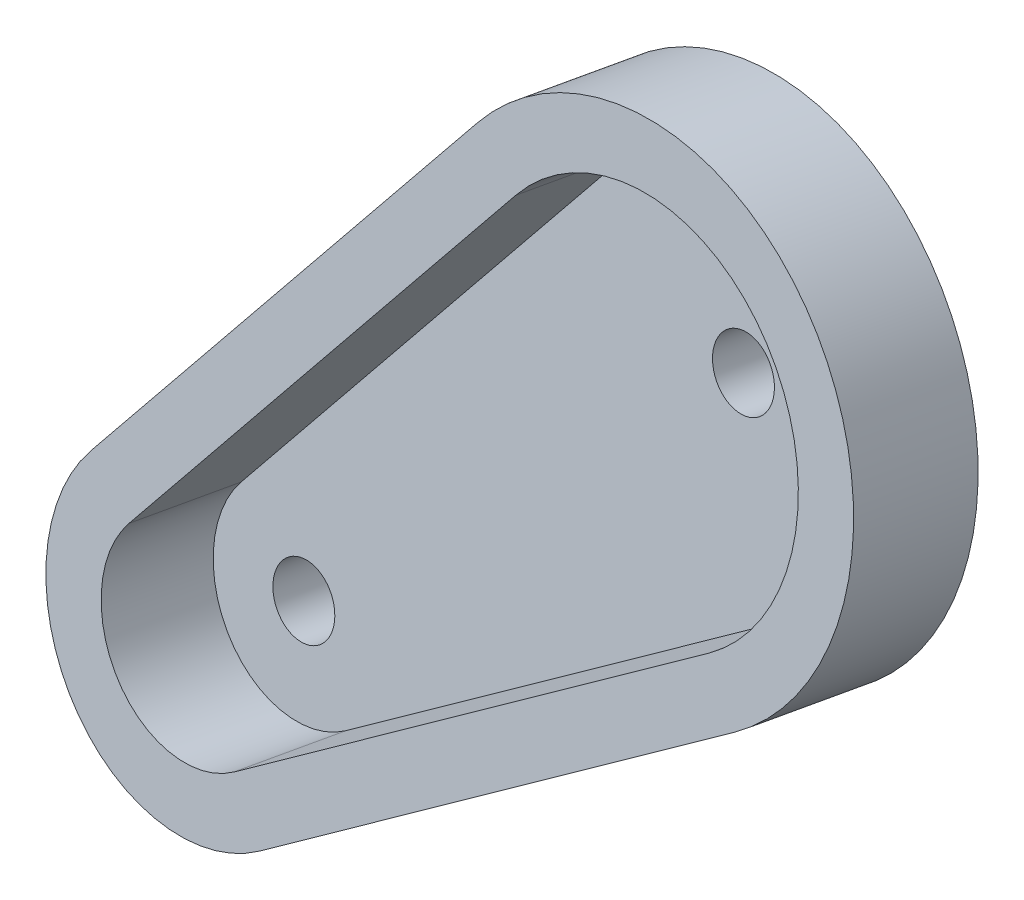
ISO-10303-21;
HEADER;
FILE_DESCRIPTION(('STEP AP214'),'2;1');
FILE_NAME('part.step','',(''),(''),'','','');
FILE_SCHEMA(('AUTOMOTIVE_DESIGN { 1 0 10303 214 1 1 1 1 }'));
ENDSEC;
DATA;
#1=APPLICATION_CONTEXT('core data for automotive mechanical design processes');
#2=APPLICATION_PROTOCOL_DEFINITION('international standard','automotive_design',2000,#1);
#3=PRODUCT_CONTEXT('',#1,'mechanical');
#4=PRODUCT('Part','Part','',(#3));
#5=PRODUCT_RELATED_PRODUCT_CATEGORY('part','',(#4));
#6=PRODUCT_DEFINITION_FORMATION('','',#4);
#7=PRODUCT_DEFINITION_CONTEXT('part definition',#1,'design');
#8=PRODUCT_DEFINITION('design','',#6,#7);
#9=PRODUCT_DEFINITION_SHAPE('','',#8);
#10=(LENGTH_UNIT() NAMED_UNIT(*) SI_UNIT(.MILLI.,.METRE.));
#11=(NAMED_UNIT(*) PLANE_ANGLE_UNIT() SI_UNIT($,.RADIAN.));
#12=(NAMED_UNIT(*) SI_UNIT($,.STERADIAN.) SOLID_ANGLE_UNIT());
#13=UNCERTAINTY_MEASURE_WITH_UNIT(LENGTH_MEASURE(1.E-05),#10,'distance_accuracy_value','');
#14=(GEOMETRIC_REPRESENTATION_CONTEXT(3) GLOBAL_UNCERTAINTY_ASSIGNED_CONTEXT((#13)) GLOBAL_UNIT_ASSIGNED_CONTEXT((#10,
#11,#12)) REPRESENTATION_CONTEXT('',''));
#15=CARTESIAN_POINT('',(0.,0.,0.));
#16=DIRECTION('',(0.,0.,1.));
#17=DIRECTION('',(1.,0.,0.));
#18=AXIS2_PLACEMENT_3D('',#15,#16,#17);
#19=CARTESIAN_POINT('',(139.042388148366,-142.913532001662,5.92533887196867));
#20=DIRECTION('',(0.0674581133210909,-0.12352330189874,-0.990046158941689));
#21=DIRECTION('',(0.,-0.992306526958391,0.123805317154703));
#22=AXIS2_PLACEMENT_3D('',#19,#20,#21);
#23=PLANE('',#22);
#24=CARTESIAN_POINT('',(156.822676569582,-126.081367524923,5.03675421849172));
#25=DIRECTION('',(-0.0674581133210909,0.12352330189874,0.990046158941689));
#26=DIRECTION('',(0.,-0.992306526958391,0.123805317154703));
#27=AXIS2_PLACEMENT_3D('',#24,#25,#26);
#28=CIRCLE('',#27,6.58589838486229);
#29=CARTESIAN_POINT('',(160.613864154695,-131.38739760596,5.95707970947262));
#30=VERTEX_POINT('',#29);
#31=CARTESIAN_POINT('',(151.685409363827,-122.049638120943,4.18370017243479));
#32=VERTEX_POINT('',#31);
#33=EDGE_CURVE('E187',#30,#32,#28,.T.);
#34=ORIENTED_EDGE('',*,*,#33,.F.);
#35=DIRECTION('',(0.814907250431126,0.579349073545028,-0.0167578094421691));
#36=VECTOR('',#35,1.);
#37=CARTESIAN_POINT('',(140.847575281559,-145.440016649436,6.36355505024256));
#38=LINE('',#37,#36);
#39=CARTESIAN_POINT('',(140.847575281559,-145.440016649436,6.36355505024256));
#40=VERTEX_POINT('',#39);
#41=EDGE_CURVE('E185',#40,#30,#38,.T.);
#42=ORIENTED_EDGE('',*,*,#41,.F.);
#43=CARTESIAN_POINT('',(139.042388148366,-142.913532001662,5.92533887196867));
#44=DIRECTION('',(-0.0674581133210909,0.12352330189874,0.990046158941689));
#45=DIRECTION('',(0.,-0.992306526958391,0.123805317154703));
#46=AXIS2_PLACEMENT_3D('',#43,#44,#45);
#47=CIRCLE('',#46,3.13589838486216);
#48=CARTESIAN_POINT('',(136.596260529671,-140.993810046157,5.51915422578908));
#49=VERTEX_POINT('',#48);
#50=EDGE_CURVE('E190',#49,#40,#47,.T.);
#51=ORIENTED_EDGE('',*,*,#50,.F.);
#52=DIRECTION('',(-0.622082216176631,-0.781013732742278,0.0550569303970384));
#53=VECTOR('',#52,1.);
#54=CARTESIAN_POINT('',(136.596260529671,-140.993810046157,5.51915422578908));
#55=LINE('',#54,#53);
#56=EDGE_CURVE('E192',#32,#49,#55,.T.);
#57=ORIENTED_EDGE('',*,*,#56,.F.);
#58=EDGE_LOOP('',(#34,#42,#51,#57));
#59=FACE_BOUND('',#58,.T.);
#60=CARTESIAN_POINT('',(156.822676569582,-126.081367524923,5.03675421849172));
#61=DIRECTION('',(-0.0674581133210909,0.12352330189874,0.990046158941689));
#62=DIRECTION('',(0.,-0.992306526958391,0.123805317154703));
#63=AXIS2_PLACEMENT_3D('',#60,#61,#62);
#64=CIRCLE('',#63,1.40000000000001);
#65=CARTESIAN_POINT('',(156.822676569582,-127.470596662665,5.2100816625083));
#66=VERTEX_POINT('',#65);
#67=EDGE_CURVE('E143',#66,#66,#64,.T.);
#68=ORIENTED_EDGE('',*,*,#67,.T.);
#69=EDGE_LOOP('',(#68));
#70=FACE_BOUND('',#69,.T.);
#71=CARTESIAN_POINT('',(139.042388148366,-142.913532001662,5.92533887196866));
#72=DIRECTION('',(-0.0674581133210909,0.12352330189874,0.990046158941689));
#73=DIRECTION('',(0.,-0.992306526958391,0.123805317154703));
#74=AXIS2_PLACEMENT_3D('',#71,#72,#73);
#75=CIRCLE('',#74,1.40000000000001);
#76=CARTESIAN_POINT('',(139.042388148366,-144.302761139403,6.09866631598525));
#77=VERTEX_POINT('',#76);
#78=EDGE_CURVE('E146',#77,#77,#75,.T.);
#79=ORIENTED_EDGE('',*,*,#78,.T.);
#80=EDGE_LOOP('',(#79));
#81=FACE_BOUND('',#80,.T.);
#82=ADVANCED_FACE('F39',(#59,#70,#81),#23,.T.);
#83=CARTESIAN_POINT('',(138.570181355119,-142.048868888371,12.8556619845605));
#84=DIRECTION('',(0.0674581133210909,-0.12352330189874,-0.990046158941689));
#85=DIRECTION('',(0.,-0.992306526958391,0.123805317154703));
#86=AXIS2_PLACEMENT_3D('',#83,#84,#85);
#87=CYLINDRICAL_SURFACE('',#86,4.10000000000003);
#88=DIRECTION('',(0.0674581133210909,-0.12352330189874,-0.990046158941689));
#89=VECTOR('',#88,1.);
#90=CARTESIAN_POINT('',(135.372015469048,-139.538946993081,12.324599799199));
#91=LINE('',#90,#89);
#92=CARTESIAN_POINT('',(135.372015469048,-139.538946993081,12.324599799199));
#93=VERTEX_POINT('',#92);
#94=CARTESIAN_POINT('',(135.675576978993,-140.094801851626,7.86939208396144));
#95=VERTEX_POINT('',#94);
#96=EDGE_CURVE('E142',#93,#95,#91,.T.);
#97=ORIENTED_EDGE('',*,*,#96,.F.);
#98=CARTESIAN_POINT('',(138.570181355119,-142.048868888371,12.8556619845605));
#99=DIRECTION('',(-0.0674581133210909,0.12352330189874,0.990046158941689));
#100=DIRECTION('',(0.,-0.992306526958391,0.123805317154703));
#101=AXIS2_PLACEMENT_3D('',#98,#99,#100);
#102=CIRCLE('',#101,4.10000000000003);
#103=CARTESIAN_POINT('',(140.930355805227,-145.352096794567,13.4286034866181));
#104=VERTEX_POINT('',#103);
#105=EDGE_CURVE('E123',#93,#104,#102,.T.);
#106=ORIENTED_EDGE('',*,*,#105,.T.);
#107=DIRECTION('',(0.0674581133210909,-0.12352330189874,-0.990046158941689));
#108=VECTOR('',#107,1.);
#109=CARTESIAN_POINT('',(140.930355805227,-145.352096794567,13.4286034866181));
#110=LINE('',#109,#108);
#111=CARTESIAN_POINT('',(141.233917315172,-145.907951653111,8.97339577138049));
#112=VERTEX_POINT('',#111);
#113=EDGE_CURVE('E131',#104,#112,#110,.T.);
#114=ORIENTED_EDGE('',*,*,#113,.T.);
#115=CARTESIAN_POINT('',(138.873742865064,-142.604723746915,8.40045426932289));
#116=DIRECTION('',(-0.0674581133210909,0.12352330189874,0.990046158941689));
#117=DIRECTION('',(0.,-0.992306526958391,0.123805317154703));
#118=AXIS2_PLACEMENT_3D('',#115,#116,#117);
#119=CIRCLE('',#118,4.10000000000001);
#120=EDGE_CURVE('E170',#95,#112,#119,.T.);
#121=ORIENTED_EDGE('',*,*,#120,.F.);
#122=EDGE_LOOP('',(#97,#106,#114,#121));
#123=FACE_BOUND('',#122,.T.);
#124=ADVANCED_FACE('F140',(#123),#87,.F.);
#125=CARTESIAN_POINT('',(150.461164303204,-120.594775067867,10.9891457458448));
#126=DIRECTION('',(-0.780040460017252,0.612176072021776,-0.12952736228328));
#127=DIRECTION('',(-0.617376949257776,-0.786667466293835,0.));
#128=AXIS2_PLACEMENT_3D('',#125,#126,#127);
#129=PLANE('',#128);
#130=DIRECTION('',(0.0674581133210909,-0.12352330189874,-0.990046158941689));
#131=VECTOR('',#130,1.);
#132=CARTESIAN_POINT('',(150.461164303204,-120.594775067867,10.9891457458448));
#133=LINE('',#132,#131);
#134=CARTESIAN_POINT('',(150.461164303204,-120.594775067867,10.9891457458448));
#135=VERTEX_POINT('',#134);
#136=CARTESIAN_POINT('',(150.764725813149,-121.150629926412,6.53393803060717));
#137=VERTEX_POINT('',#136);
#138=EDGE_CURVE('E154',#135,#137,#133,.T.);
#139=ORIENTED_EDGE('',*,*,#138,.F.);
#140=DIRECTION('',(-0.622082216176635,-0.781013732742275,0.055056930397038));
#141=VECTOR('',#140,1.);
#142=CARTESIAN_POINT('',(150.461164303204,-120.594775067867,10.9891457458448));
#143=LINE('',#142,#141);
#144=EDGE_CURVE('E138',#135,#93,#143,.T.);
#145=ORIENTED_EDGE('',*,*,#144,.T.);
#146=ORIENTED_EDGE('',*,*,#96,.T.);
#147=DIRECTION('',(-0.622082216176634,-0.781013732742276,0.0550569303970381));
#148=VECTOR('',#147,1.);
#149=CARTESIAN_POINT('',(135.675576978993,-140.094801851626,7.86939208396144));
#150=LINE('',#149,#148);
#151=EDGE_CURVE('E183',#137,#95,#150,.T.);
#152=ORIENTED_EDGE('',*,*,#151,.F.);
#153=EDGE_LOOP('',(#139,#145,#146,#152));
#154=FACE_BOUND('',#153,.T.);
#155=ADVANCED_FACE('F238',(#154),#129,.F.);
#156=CARTESIAN_POINT('',(156.350469776334,-125.216704411632,11.9670773310835));
#157=DIRECTION('',(0.0674581133210909,-0.12352330189874,-0.990046158941689));
#158=DIRECTION('',(0.,-0.992306526958391,0.123805317154703));
#159=AXIS2_PLACEMENT_3D('',#156,#157,#158);
#160=CYLINDRICAL_SURFACE('',#159,7.55000000000003);
#161=DIRECTION('',(0.0674581133210909,-0.12352330189874,-0.990046158941689));
#162=VECTOR('',#161,1.);
#163=CARTESIAN_POINT('',(160.696644678364,-131.299477751091,13.0221281458481));
#164=LINE('',#163,#162);
#165=CARTESIAN_POINT('',(160.696644678364,-131.299477751091,13.0221281458481));
#166=VERTEX_POINT('',#165);
#167=CARTESIAN_POINT('',(161.000206188309,-131.855332609635,8.56692043061055));
#168=VERTEX_POINT('',#167);
#169=EDGE_CURVE('E137',#166,#168,#164,.T.);
#170=ORIENTED_EDGE('',*,*,#169,.F.);
#171=CARTESIAN_POINT('',(156.350469776334,-125.216704411632,11.9670773310835));
#172=DIRECTION('',(-0.0674581133210909,0.12352330189874,0.990046158941689));
#173=DIRECTION('',(0.,-0.992306526958391,0.123805317154703));
#174=AXIS2_PLACEMENT_3D('',#171,#172,#173);
#175=CIRCLE('',#174,7.55000000000003);
#176=EDGE_CURVE('E125',#166,#135,#175,.T.);
#177=ORIENTED_EDGE('',*,*,#176,.T.);
#178=ORIENTED_EDGE('',*,*,#138,.T.);
#179=CARTESIAN_POINT('',(156.654031286279,-125.772559270176,7.51186961584594));
#180=DIRECTION('',(-0.0674581133210909,0.12352330189874,0.990046158941689));
#181=DIRECTION('',(0.,-0.992306526958391,0.123805317154703));
#182=AXIS2_PLACEMENT_3D('',#179,#180,#181);
#183=CIRCLE('',#182,7.55000000000001);
#184=EDGE_CURVE('E181',#168,#137,#183,.T.);
#185=ORIENTED_EDGE('',*,*,#184,.F.);
#186=EDGE_LOOP('',(#170,#177,#178,#185));
#187=FACE_BOUND('',#186,.T.);
#188=ADVANCED_FACE('F376',(#187),#160,.F.);
#189=CARTESIAN_POINT('',(140.930355805227,-145.352096794567,13.4286034866181));
#190=DIRECTION('',(0.575652304904566,-0.805665342974707,0.139741829770146));
#191=DIRECTION('',(0.813648888188022,0.581356591732128,0.));
#192=AXIS2_PLACEMENT_3D('',#189,#190,#191);
#193=PLANE('',#192);
#194=ORIENTED_EDGE('',*,*,#113,.F.);
#195=DIRECTION('',(0.814907250431127,0.579349073545026,-0.016757809442169));
#196=VECTOR('',#195,1.);
#197=CARTESIAN_POINT('',(140.930355805227,-145.352096794567,13.4286034866181));
#198=LINE('',#197,#196);
#199=EDGE_CURVE('E117',#104,#166,#198,.T.);
#200=ORIENTED_EDGE('',*,*,#199,.T.);
#201=ORIENTED_EDGE('',*,*,#169,.T.);
#202=DIRECTION('',(0.814907250431126,0.579349073545027,-0.0167578094421692));
#203=VECTOR('',#202,1.);
#204=CARTESIAN_POINT('',(141.233917315172,-145.907951653111,8.97339577138049));
#205=LINE('',#204,#203);
#206=EDGE_CURVE('E133',#112,#168,#205,.T.);
#207=ORIENTED_EDGE('',*,*,#206,.F.);
#208=EDGE_LOOP('',(#194,#200,#201,#207));
#209=FACE_BOUND('',#208,.T.);
#210=ADVANCED_FACE('F132',(#209),#193,.F.);
#211=CARTESIAN_POINT('',(138.570181355119,-142.048868888371,12.8556619845605));
#212=DIRECTION('',(0.0674581133210909,-0.12352330189874,-0.990046158941689));
#213=DIRECTION('',(0.,-0.992306526958391,0.123805317154703));
#214=AXIS2_PLACEMENT_3D('',#211,#212,#213);
#215=CYLINDRICAL_SURFACE('',#214,6.6);
#216=DIRECTION('',(0.0674581133210909,-0.12352330189874,-0.990046158941689));
#217=VECTOR('',#216,1.);
#218=CARTESIAN_POINT('',(142.369486567489,-147.366260152004,13.7779580610435));
#219=LINE('',#218,#217);
#220=CARTESIAN_POINT('',(142.369486567489,-147.366260152004,13.7779580610435));
#221=VERTEX_POINT('',#220);
#222=CARTESIAN_POINT('',(142.706777134094,-147.983876661497,8.82772726633504));
#223=VERTEX_POINT('',#222);
#224=EDGE_CURVE('E166',#221,#223,#219,.T.);
#225=ORIENTED_EDGE('',*,*,#224,.F.);
#226=CARTESIAN_POINT('',(138.570181355119,-142.048868888371,12.8556619845605));
#227=DIRECTION('',(-0.0674581133210909,0.12352330189874,0.990046158941689));
#228=DIRECTION('',(0.,-0.992306526958391,0.123805317154703));
#229=AXIS2_PLACEMENT_3D('',#226,#227,#228);
#230=CIRCLE('',#229,6.6);
#231=CARTESIAN_POINT('',(133.421914319005,-138.008506813027,12.0007813934908));
#232=VERTEX_POINT('',#231);
#233=EDGE_CURVE('E153',#232,#221,#230,.T.);
#234=ORIENTED_EDGE('',*,*,#233,.F.);
#235=DIRECTION('',(0.0674581133210909,-0.12352330189874,-0.990046158941689));
#236=VECTOR('',#235,1.);
#237=CARTESIAN_POINT('',(133.421914319005,-138.008506813027,12.0007813934908));
#238=LINE('',#237,#236);
#239=CARTESIAN_POINT('',(133.75920488561,-138.626123322521,7.05055059878238));
#240=VERTEX_POINT('',#239);
#241=EDGE_CURVE('E167',#232,#240,#238,.T.);
#242=ORIENTED_EDGE('',*,*,#241,.T.);
#243=CARTESIAN_POINT('',(138.907471921724,-142.666485397864,7.90543118985206));
#244=DIRECTION('',(-0.0674581133210945,0.123523301898742,0.990046158941688));
#245=DIRECTION('',(0.,-0.99230652695839,0.123805317154705));
#246=AXIS2_PLACEMENT_3D('',#243,#244,#245);
#247=CIRCLE('',#246,6.6);
#248=EDGE_CURVE('E198',#223,#240,#247,.F.);
#249=ORIENTED_EDGE('',*,*,#248,.F.);
#250=EDGE_LOOP('',(#225,#234,#242,#249));
#251=FACE_BOUND('',#250,.T.);
#252=ADVANCED_FACE('F243',(#251),#215,.T.);
#253=CARTESIAN_POINT('',(148.511063153161,-119.064334887813,10.6653273401366));
#254=DIRECTION('',(-0.780040460017255,0.612176072021772,-0.12952736228328));
#255=DIRECTION('',(-0.617376949257772,-0.786667466293838,0.));
#256=AXIS2_PLACEMENT_3D('',#253,#254,#255);
#257=PLANE('',#256);
#258=ORIENTED_EDGE('',*,*,#241,.F.);
#259=DIRECTION('',(-0.622082216176631,-0.781013732742278,0.0550569303970383));
#260=VECTOR('',#259,1.);
#261=CARTESIAN_POINT('',(148.511063153161,-119.064334887813,10.6653273401366));
#262=LINE('',#261,#260);
#263=CARTESIAN_POINT('',(148.511063153161,-119.064334887813,10.6653273401366));
#264=VERTEX_POINT('',#263);
#265=EDGE_CURVE('E164',#264,#232,#262,.T.);
#266=ORIENTED_EDGE('',*,*,#265,.F.);
#267=DIRECTION('',(0.0674581133210909,-0.12352330189874,-0.990046158941689));
#268=VECTOR('',#267,1.);
#269=CARTESIAN_POINT('',(148.511063153161,-119.064334887813,10.6653273401366));
#270=LINE('',#269,#268);
#271=CARTESIAN_POINT('',(148.848353719766,-119.681951397307,5.71509654542811));
#272=VERTEX_POINT('',#271);
#273=EDGE_CURVE('E171',#264,#272,#270,.T.);
#274=ORIENTED_EDGE('',*,*,#273,.T.);
#275=DIRECTION('',(0.622082216176631,0.781013732742278,-0.0550569303970384));
#276=VECTOR('',#275,1.);
#277=CARTESIAN_POINT('',(148.848353719766,-119.681951397307,5.71509654542814));
#278=LINE('',#277,#276);
#279=EDGE_CURVE('E195',#240,#272,#278,.T.);
#280=ORIENTED_EDGE('',*,*,#279,.F.);
#281=EDGE_LOOP('',(#258,#266,#274,#280));
#282=FACE_BOUND('',#281,.T.);
#283=ADVANCED_FACE('F277',(#282),#257,.T.);
#284=CARTESIAN_POINT('',(156.350469776334,-125.216704411632,11.9670773310835));
#285=DIRECTION('',(0.0674581133210909,-0.12352330189874,-0.990046158941689));
#286=DIRECTION('',(0.,-0.992306526958391,0.123805317154703));
#287=AXIS2_PLACEMENT_3D('',#284,#285,#286);
#288=CYLINDRICAL_SURFACE('',#287,10.05);
#289=ORIENTED_EDGE('',*,*,#273,.F.);
#290=CARTESIAN_POINT('',(156.350469776334,-125.216704411632,11.9670773310835));
#291=DIRECTION('',(-0.0674581133210909,0.12352330189874,0.990046158941689));
#292=DIRECTION('',(0.,-0.992306526958391,0.123805317154703));
#293=AXIS2_PLACEMENT_3D('',#290,#291,#292);
#294=CIRCLE('',#293,10.05);
#295=CARTESIAN_POINT('',(162.135775440625,-133.313641108528,13.3714827202735));
#296=VERTEX_POINT('',#295);
#297=EDGE_CURVE('E162',#296,#264,#294,.T.);
#298=ORIENTED_EDGE('',*,*,#297,.F.);
#299=DIRECTION('',(0.0674581133210909,-0.12352330189874,-0.990046158941689));
#300=VECTOR('',#299,1.);
#301=CARTESIAN_POINT('',(162.135775440625,-133.313641108528,13.3714827202735));
#302=LINE('',#301,#300);
#303=CARTESIAN_POINT('',(162.473066007231,-133.931257618021,8.42125192556509));
#304=VERTEX_POINT('',#303);
#305=EDGE_CURVE('E174',#296,#304,#302,.T.);
#306=ORIENTED_EDGE('',*,*,#305,.T.);
#307=CARTESIAN_POINT('',(156.68776034294,-125.834320921126,7.01684653637512));
#308=DIRECTION('',(-0.0674581133210946,0.123523301898742,0.990046158941688));
#309=DIRECTION('',(0.,-0.99230652695839,0.123805317154705));
#310=AXIS2_PLACEMENT_3D('',#307,#308,#309);
#311=CIRCLE('',#310,10.05);
#312=EDGE_CURVE('E48',#272,#304,#311,.F.);
#313=ORIENTED_EDGE('',*,*,#312,.F.);
#314=EDGE_LOOP('',(#289,#298,#306,#313));
#315=FACE_BOUND('',#314,.T.);
#316=ADVANCED_FACE('F265',(#315),#288,.T.);
#317=CARTESIAN_POINT('',(142.369486567489,-147.366260152004,13.7779580610435));
#318=DIRECTION('',(0.575652304904567,-0.805665342974706,0.139741829770146));
#319=DIRECTION('',(0.813648888188021,0.58135659173213,0.));
#320=AXIS2_PLACEMENT_3D('',#317,#318,#319);
#321=PLANE('',#320);
#322=ORIENTED_EDGE('',*,*,#305,.F.);
#323=DIRECTION('',(0.814907250431126,0.579349073545028,-0.0167578094421692));
#324=VECTOR('',#323,1.);
#325=CARTESIAN_POINT('',(142.369486567489,-147.366260152004,13.7779580610435));
#326=LINE('',#325,#324);
#327=EDGE_CURVE('E160',#221,#296,#326,.T.);
#328=ORIENTED_EDGE('',*,*,#327,.F.);
#329=ORIENTED_EDGE('',*,*,#224,.T.);
#330=DIRECTION('',(-0.814907250431126,-0.579349073545028,0.0167578094421691));
#331=VECTOR('',#330,1.);
#332=CARTESIAN_POINT('',(142.706777134094,-147.983876661497,8.82772726633504));
#333=LINE('',#332,#331);
#334=EDGE_CURVE('E11',#304,#223,#333,.T.);
#335=ORIENTED_EDGE('',*,*,#334,.F.);
#336=EDGE_LOOP('',(#322,#328,#329,#335));
#337=FACE_BOUND('',#336,.T.);
#338=ADVANCED_FACE('F270',(#337),#321,.T.);
#339=CARTESIAN_POINT('',(138.570181355119,-142.048868888371,12.8556619845605));
#340=DIRECTION('',(0.0674581133210909,-0.12352330189874,-0.990046158941689));
#341=DIRECTION('',(0.,-0.992306526958391,0.123805317154703));
#342=AXIS2_PLACEMENT_3D('',#339,#340,#341);
#343=PLANE('',#342);
#344=ORIENTED_EDGE('',*,*,#144,.F.);
#345=ORIENTED_EDGE('',*,*,#176,.F.);
#346=ORIENTED_EDGE('',*,*,#199,.F.);
#347=ORIENTED_EDGE('',*,*,#105,.F.);
#348=EDGE_LOOP('',(#344,#345,#346,#347));
#349=FACE_BOUND('',#348,.T.);
#350=ORIENTED_EDGE('',*,*,#233,.T.);
#351=ORIENTED_EDGE('',*,*,#327,.T.);
#352=ORIENTED_EDGE('',*,*,#297,.T.);
#353=ORIENTED_EDGE('',*,*,#265,.T.);
#354=EDGE_LOOP('',(#350,#351,#352,#353));
#355=FACE_BOUND('',#354,.T.);
#356=ADVANCED_FACE('F120',(#349,#355),#343,.F.);
#357=CARTESIAN_POINT('',(138.873742865064,-142.604723746915,8.40045426932289));
#358=DIRECTION('',(0.0674581133210909,-0.12352330189874,-0.990046158941689));
#359=DIRECTION('',(0.,-0.992306526958391,0.123805317154703));
#360=AXIS2_PLACEMENT_3D('',#357,#358,#359);
#361=PLANE('',#360);
#362=CARTESIAN_POINT('',(156.654031286279,-125.772559270176,7.51186961584597));
#363=DIRECTION('',(0.0674581133210908,-0.12352330189874,-0.990046158941689));
#364=DIRECTION('',(0.,0.992306526958391,-0.123805317154703));
#365=AXIS2_PLACEMENT_3D('',#362,#363,#364);
#366=CIRCLE('',#365,1.40000000000001);
#367=CARTESIAN_POINT('',(156.654031286279,-124.383330132434,7.33854217182938));
#368=VERTEX_POINT('',#367);
#369=EDGE_CURVE('E207',#368,#368,#366,.T.);
#370=ORIENTED_EDGE('',*,*,#369,.T.);
#371=EDGE_LOOP('',(#370));
#372=FACE_BOUND('',#371,.T.);
#373=CARTESIAN_POINT('',(138.873742865063,-142.604723746915,8.40045426932291));
#374=DIRECTION('',(0.0674581133210908,-0.12352330189874,-0.990046158941689));
#375=DIRECTION('',(0.,0.992306526958391,-0.123805317154703));
#376=AXIS2_PLACEMENT_3D('',#373,#374,#375);
#377=CIRCLE('',#376,1.40000000000001);
#378=CARTESIAN_POINT('',(138.873742865063,-141.215494609173,8.22712682530633));
#379=VERTEX_POINT('',#378);
#380=EDGE_CURVE('E205',#379,#379,#377,.T.);
#381=ORIENTED_EDGE('',*,*,#380,.T.);
#382=EDGE_LOOP('',(#381));
#383=FACE_BOUND('',#382,.T.);
#384=ORIENTED_EDGE('',*,*,#120,.T.);
#385=ORIENTED_EDGE('',*,*,#206,.T.);
#386=ORIENTED_EDGE('',*,*,#184,.T.);
#387=ORIENTED_EDGE('',*,*,#151,.T.);
#388=EDGE_LOOP('',(#384,#385,#386,#387));
#389=FACE_BOUND('',#388,.T.);
#390=ADVANCED_FACE('F221',(#372,#383,#389),#361,.F.);
#391=CARTESIAN_POINT('',(139.377315842078,-143.526821828308,1.00978668176809));
#392=DIRECTION('',(-0.0674581133210909,0.12352330189874,0.990046158941689));
#393=DIRECTION('',(0.,0.992306526958391,-0.123805317154703));
#394=AXIS2_PLACEMENT_3D('',#391,#392,#393);
#395=CYLINDRICAL_SURFACE('',#394,1.40000000000001);
#396=ORIENTED_EDGE('',*,*,#78,.F.);
#397=EDGE_LOOP('',(#396));
#398=FACE_BOUND('',#397,.T.);
#399=ORIENTED_EDGE('',*,*,#380,.F.);
#400=EDGE_LOOP('',(#399));
#401=FACE_BOUND('',#400,.T.);
#402=ADVANCED_FACE('F217',(#398,#401),#395,.F.);
#403=CARTESIAN_POINT('',(157.157604263294,-126.694657351569,0.121202028291147));
#404=DIRECTION('',(-0.0674581133210909,0.12352330189874,0.990046158941689));
#405=DIRECTION('',(0.,0.992306526958391,-0.123805317154703));
#406=AXIS2_PLACEMENT_3D('',#403,#404,#405);
#407=CYLINDRICAL_SURFACE('',#406,1.40000000000001);
#408=ORIENTED_EDGE('',*,*,#67,.F.);
#409=EDGE_LOOP('',(#408));
#410=FACE_BOUND('',#409,.T.);
#411=ORIENTED_EDGE('',*,*,#369,.F.);
#412=EDGE_LOOP('',(#411));
#413=FACE_BOUND('',#412,.T.);
#414=ADVANCED_FACE('F220',(#410,#413),#407,.F.);
#415=CARTESIAN_POINT('',(140.847575281559,-145.440016649436,6.36355505024256));
#416=DIRECTION('',(-0.346246592279718,0.509806988890996,0.787534209677636));
#417=DIRECTION('',(0.814907250431126,0.579349073545028,-0.0167578094421691));
#418=AXIS2_PLACEMENT_3D('',#415,#416,#417);
#419=PLANE('',#418);
#420=DIRECTION('',(-0.464800463133868,0.635965003015431,-0.616043054023113));
#421=VECTOR('',#420,1.);
#422=CARTESIAN_POINT('',(142.706777134094,-147.983876661497,8.82772726633504));
#423=LINE('',#422,#421);
#424=EDGE_CURVE('E62',#223,#40,#423,.T.);
#425=ORIENTED_EDGE('',*,*,#424,.T.);
#426=ORIENTED_EDGE('',*,*,#41,.T.);
#427=DIRECTION('',(0.464800463133874,-0.635965003015429,0.616043054023111));
#428=VECTOR('',#427,1.);
#429=CARTESIAN_POINT('',(160.613864154695,-131.38739760596,5.95707970947262));
#430=LINE('',#429,#428);
#431=EDGE_CURVE('E43',#30,#304,#430,.T.);
#432=ORIENTED_EDGE('',*,*,#431,.T.);
#433=ORIENTED_EDGE('',*,*,#334,.T.);
#434=EDGE_LOOP('',(#425,#426,#432,#433));
#435=FACE_BOUND('',#434,.T.);
#436=ADVANCED_FACE('F41',(#435),#419,.F.);
#437=CARTESIAN_POINT('',(156.822676569582,-126.081367524923,5.03675421849172));
#438=DIRECTION('',(-0.0674581133210946,0.123523301898742,0.990046158941688));
#439=DIRECTION('',(0.,0.99230652695839,-0.123805317154705));
#440=AXIS2_PLACEMENT_3D('',#437,#438,#439);
#441=CONICAL_SURFACE('',#440,6.58589838486223,1.0471975511966);
#442=ORIENTED_EDGE('',*,*,#431,.F.);
#443=ORIENTED_EDGE('',*,*,#33,.T.);
#444=DIRECTION('',(-0.709263911015186,0.5919216809092,0.382849093248331));
#445=VECTOR('',#444,1.);
#446=CARTESIAN_POINT('',(151.685409363827,-122.049638120943,4.18370017243479));
#447=LINE('',#446,#445);
#448=EDGE_CURVE('E204',#32,#272,#447,.T.);
#449=ORIENTED_EDGE('',*,*,#448,.T.);
#450=ORIENTED_EDGE('',*,*,#312,.T.);
#451=EDGE_LOOP('',(#442,#443,#449,#450));
#452=FACE_BOUND('',#451,.T.);
#453=ADVANCED_FACE('F252',(#452),#441,.T.);
#454=CARTESIAN_POINT('',(139.042388148366,-142.913532001662,5.92533887196867));
#455=DIRECTION('',(-0.0674581133210945,0.123523301898742,0.990046158941688));
#456=DIRECTION('',(0.,0.99230652695839,-0.123805317154705));
#457=AXIS2_PLACEMENT_3D('',#454,#455,#456);
#458=CONICAL_SURFACE('',#457,3.13589838486218,1.0471975511966);
#459=ORIENTED_EDGE('',*,*,#424,.F.);
#460=ORIENTED_EDGE('',*,*,#248,.T.);
#461=DIRECTION('',(0.709263911015196,-0.591921680909196,-0.382849093248319));
#462=VECTOR('',#461,1.);
#463=CARTESIAN_POINT('',(133.75920488561,-138.626123322521,7.05055059878238));
#464=LINE('',#463,#462);
#465=EDGE_CURVE('E202',#240,#49,#464,.T.);
#466=ORIENTED_EDGE('',*,*,#465,.T.);
#467=ORIENTED_EDGE('',*,*,#50,.T.);
#468=EDGE_LOOP('',(#459,#460,#466,#467));
#469=FACE_BOUND('',#468,.T.);
#470=ADVANCED_FACE('F249',(#469),#458,.T.);
#471=CARTESIAN_POINT('',(136.596260529671,-140.993810046157,5.51915422578908));
#472=DIRECTION('',(0.331599790181188,-0.199113718607239,0.922168805704351));
#473=DIRECTION('',(-0.622082216176631,-0.781013732742278,0.0550569303970384));
#474=AXIS2_PLACEMENT_3D('',#471,#472,#473);
#475=PLANE('',#474);
#476=ORIENTED_EDGE('',*,*,#448,.F.);
#477=ORIENTED_EDGE('',*,*,#56,.T.);
#478=ORIENTED_EDGE('',*,*,#465,.F.);
#479=ORIENTED_EDGE('',*,*,#279,.T.);
#480=EDGE_LOOP('',(#476,#477,#478,#479));
#481=FACE_BOUND('',#480,.T.);
#482=ADVANCED_FACE('F246',(#481),#475,.F.);
#483=CLOSED_SHELL('',(#82,#124,#155,#188,#210,#252,#283,#316,#338,#356,#390,#402,#414,#436,#453,
#470,#482));
#484=MANIFOLD_SOLID_BREP('B2',#483);
#485=ADVANCED_BREP_SHAPE_REPRESENTATION('',(#18,#484),#14);
#486=SHAPE_DEFINITION_REPRESENTATION(#9,#485);
ENDSEC;
END-ISO-10303-21;
